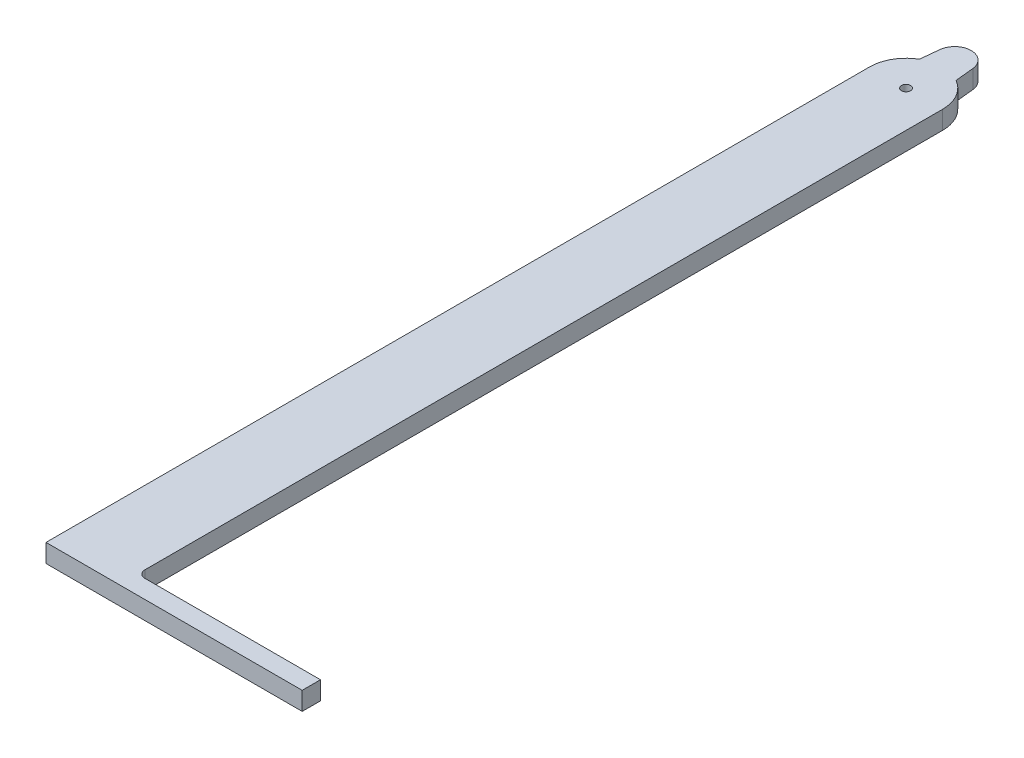
ISO-10303-21;
HEADER;
FILE_DESCRIPTION(('STEP AP214'),'2;1');
FILE_NAME('part.step','',(''),(''),'','','');
FILE_SCHEMA(('AUTOMOTIVE_DESIGN { 1 0 10303 214 1 1 1 1 }'));
ENDSEC;
DATA;
#1=APPLICATION_CONTEXT('core data for automotive mechanical design processes');
#2=APPLICATION_PROTOCOL_DEFINITION('international standard','automotive_design',2000,#1);
#3=PRODUCT_CONTEXT('',#1,'mechanical');
#4=PRODUCT('Part','Part','',(#3));
#5=PRODUCT_RELATED_PRODUCT_CATEGORY('part','',(#4));
#6=PRODUCT_DEFINITION_FORMATION('','',#4);
#7=PRODUCT_DEFINITION_CONTEXT('part definition',#1,'design');
#8=PRODUCT_DEFINITION('design','',#6,#7);
#9=PRODUCT_DEFINITION_SHAPE('','',#8);
#10=(LENGTH_UNIT() NAMED_UNIT(*) SI_UNIT(.MILLI.,.METRE.));
#11=(NAMED_UNIT(*) PLANE_ANGLE_UNIT() SI_UNIT($,.RADIAN.));
#12=(NAMED_UNIT(*) SI_UNIT($,.STERADIAN.) SOLID_ANGLE_UNIT());
#13=UNCERTAINTY_MEASURE_WITH_UNIT(LENGTH_MEASURE(1.E-05),#10,'distance_accuracy_value','');
#14=(GEOMETRIC_REPRESENTATION_CONTEXT(3) GLOBAL_UNCERTAINTY_ASSIGNED_CONTEXT((#13)) GLOBAL_UNIT_ASSIGNED_CONTEXT((#10,
#11,#12)) REPRESENTATION_CONTEXT('',''));
#15=CARTESIAN_POINT('',(0.,0.,0.));
#16=DIRECTION('',(0.,0.,1.));
#17=DIRECTION('',(1.,0.,0.));
#18=AXIS2_PLACEMENT_3D('',#15,#16,#17);
#19=CARTESIAN_POINT('',(0.,6.35,0.));
#20=DIRECTION('',(0.,-1.,0.));
#21=DIRECTION('',(0.,0.,-1.));
#22=AXIS2_PLACEMENT_3D('',#19,#20,#21);
#23=CYLINDRICAL_SURFACE('',#22,12.7);
#24=CARTESIAN_POINT('',(0.,6.35,0.));
#25=DIRECTION('',(0.,1.,0.));
#26=DIRECTION('',(0.,0.,1.));
#27=AXIS2_PLACEMENT_3D('',#24,#25,#26);
#28=CIRCLE('',#27,12.7);
#29=CARTESIAN_POINT('',(-6.37039518248316,6.35,-10.9867222236204));
#30=VERTEX_POINT('',#29);
#31=CARTESIAN_POINT('',(-12.7,6.35,0.));
#32=VERTEX_POINT('',#31);
#33=EDGE_CURVE('E193',#30,#32,#28,.T.);
#34=ORIENTED_EDGE('',*,*,#33,.F.);
#35=DIRECTION('',(0.,-1.,0.));
#36=VECTOR('',#35,1.);
#37=CARTESIAN_POINT('',(-6.37039518248315,6.35,-10.9867222236204));
#38=LINE('',#37,#36);
#39=CARTESIAN_POINT('',(-6.37039518248316,0.,-10.9867222236204));
#40=VERTEX_POINT('',#39);
#41=EDGE_CURVE('E150',#30,#40,#38,.T.);
#42=ORIENTED_EDGE('',*,*,#41,.T.);
#43=CARTESIAN_POINT('',(0.,0.,0.));
#44=DIRECTION('',(0.,1.,0.));
#45=DIRECTION('',(0.,0.,1.));
#46=AXIS2_PLACEMENT_3D('',#43,#44,#45);
#47=CIRCLE('',#46,12.7);
#48=CARTESIAN_POINT('',(-12.7,0.,0.));
#49=VERTEX_POINT('',#48);
#50=EDGE_CURVE('E189',#40,#49,#47,.T.);
#51=ORIENTED_EDGE('',*,*,#50,.T.);
#52=DIRECTION('',(0.,-1.,0.));
#53=VECTOR('',#52,1.);
#54=CARTESIAN_POINT('',(-12.7,6.35,0.));
#55=LINE('',#54,#53);
#56=EDGE_CURVE('E178',#32,#49,#55,.T.);
#57=ORIENTED_EDGE('',*,*,#56,.F.);
#58=EDGE_LOOP('',(#34,#42,#51,#57));
#59=FACE_BOUND('',#58,.T.);
#60=ADVANCED_FACE('F35',(#59),#23,.T.);
#61=CARTESIAN_POINT('',(12.7,6.35,0.));
#62=DIRECTION('',(1.,0.,0.));
#63=DIRECTION('',(0.,0.,-1.));
#64=AXIS2_PLACEMENT_3D('',#61,#62,#63);
#65=PLANE('',#64);
#66=DIRECTION('',(0.,0.,1.));
#67=VECTOR('',#66,1.);
#68=CARTESIAN_POINT('',(12.7,6.35,0.));
#69=LINE('',#68,#67);
#70=CARTESIAN_POINT('',(12.7,6.35,0.));
#71=VERTEX_POINT('',#70);
#72=CARTESIAN_POINT('',(12.7,6.35,276.86));
#73=VERTEX_POINT('',#72);
#74=EDGE_CURVE('E192',#71,#73,#69,.T.);
#75=ORIENTED_EDGE('',*,*,#74,.T.);
#76=DIRECTION('',(0.,-1.,0.));
#77=VECTOR('',#76,1.);
#78=CARTESIAN_POINT('',(12.7,0.,276.86));
#79=LINE('',#78,#77);
#80=CARTESIAN_POINT('',(12.7,0.,276.86));
#81=VERTEX_POINT('',#80);
#82=EDGE_CURVE('E165',#73,#81,#79,.T.);
#83=ORIENTED_EDGE('',*,*,#82,.T.);
#84=DIRECTION('',(0.,0.,1.));
#85=VECTOR('',#84,1.);
#86=CARTESIAN_POINT('',(12.7,0.,0.));
#87=LINE('',#86,#85);
#88=CARTESIAN_POINT('',(12.7,0.,0.));
#89=VERTEX_POINT('',#88);
#90=EDGE_CURVE('E187',#89,#81,#87,.T.);
#91=ORIENTED_EDGE('',*,*,#90,.F.);
#92=DIRECTION('',(0.,-1.,0.));
#93=VECTOR('',#92,1.);
#94=CARTESIAN_POINT('',(12.7,6.35,0.));
#95=LINE('',#94,#93);
#96=EDGE_CURVE('E173',#71,#89,#95,.T.);
#97=ORIENTED_EDGE('',*,*,#96,.F.);
#98=EDGE_LOOP('',(#75,#83,#91,#97));
#99=FACE_BOUND('',#98,.T.);
#100=ADVANCED_FACE('F244',(#99),#65,.T.);
#101=CARTESIAN_POINT('',(6.37039518248316,0.,-10.9867222236204));
#102=VERTEX_POINT('',#101);
#103=EDGE_CURVE('E199',#89,#102,#47,.T.);
#104=ORIENTED_EDGE('',*,*,#103,.T.);
#105=DIRECTION('',(0.,-1.,0.));
#106=VECTOR('',#105,1.);
#107=CARTESIAN_POINT('',(6.37039518248316,6.35,-10.9867222236204));
#108=LINE('',#107,#106);
#109=CARTESIAN_POINT('',(6.37039518248316,6.35,-10.9867222236204));
#110=VERTEX_POINT('',#109);
#111=EDGE_CURVE('E128',#102,#110,#108,.F.);
#112=ORIENTED_EDGE('',*,*,#111,.T.);
#113=EDGE_CURVE('E197',#71,#110,#28,.T.);
#114=ORIENTED_EDGE('',*,*,#113,.F.);
#115=ORIENTED_EDGE('',*,*,#96,.T.);
#116=EDGE_LOOP('',(#104,#112,#114,#115));
#117=FACE_BOUND('',#116,.T.);
#118=ADVANCED_FACE('F243',(#117),#23,.T.);
#119=CARTESIAN_POINT('',(-12.7,6.35,0.));
#120=DIRECTION('',(1.,0.,0.));
#121=DIRECTION('',(0.,0.,-1.));
#122=AXIS2_PLACEMENT_3D('',#119,#120,#121);
#123=PLANE('',#122);
#124=DIRECTION('',(0.,0.,1.));
#125=VECTOR('',#124,1.);
#126=CARTESIAN_POINT('',(-12.7,0.,0.));
#127=LINE('',#126,#125);
#128=CARTESIAN_POINT('',(-12.7,0.,285.75));
#129=VERTEX_POINT('',#128);
#130=EDGE_CURVE('E194',#49,#129,#127,.T.);
#131=ORIENTED_EDGE('',*,*,#130,.T.);
#132=DIRECTION('',(0.,1.,0.));
#133=VECTOR('',#132,1.);
#134=CARTESIAN_POINT('',(-12.7,-89.1264971823756,285.75));
#135=LINE('',#134,#133);
#136=CARTESIAN_POINT('',(-12.7,6.35,285.75));
#137=VERTEX_POINT('',#136);
#138=EDGE_CURVE('E211',#129,#137,#135,.T.);
#139=ORIENTED_EDGE('',*,*,#138,.T.);
#140=DIRECTION('',(0.,0.,1.));
#141=VECTOR('',#140,1.);
#142=CARTESIAN_POINT('',(-12.7,6.35,0.));
#143=LINE('',#142,#141);
#144=EDGE_CURVE('E183',#32,#137,#143,.T.);
#145=ORIENTED_EDGE('',*,*,#144,.F.);
#146=ORIENTED_EDGE('',*,*,#56,.T.);
#147=EDGE_LOOP('',(#131,#139,#145,#146));
#148=FACE_BOUND('',#147,.T.);
#149=ADVANCED_FACE('F221',(#148),#123,.F.);
#150=CARTESIAN_POINT('',(0.,6.35,0.));
#151=DIRECTION('',(0.,1.,0.));
#152=DIRECTION('',(0.,0.,1.));
#153=AXIS2_PLACEMENT_3D('',#150,#151,#152);
#154=PLANE('',#153);
#155=CARTESIAN_POINT('',(0.,6.35,0.));
#156=DIRECTION('',(0.,-1.,0.));
#157=DIRECTION('',(0.,0.,-1.));
#158=AXIS2_PLACEMENT_3D('',#155,#156,#157);
#159=CIRCLE('',#158,1.5875);
#160=CARTESIAN_POINT('',(0.,6.35,-1.5875));
#161=VERTEX_POINT('',#160);
#162=EDGE_CURVE('E132',#161,#161,#159,.T.);
#163=ORIENTED_EDGE('',*,*,#162,.T.);
#164=EDGE_LOOP('',(#163));
#165=FACE_BOUND('',#164,.T.);
#166=ORIENTED_EDGE('',*,*,#113,.T.);
#167=DIRECTION('',(0.10317527247145,0.,0.994663190809051));
#168=VECTOR('',#167,1.);
#169=CARTESIAN_POINT('',(7.38412422898595,6.35,-1.21384793061289));
#170=LINE('',#169,#168);
#171=CARTESIAN_POINT('',(5.69805563081873,6.35,-17.4684245515761));
#172=VERTEX_POINT('',#171);
#173=EDGE_CURVE('E50',#172,#110,#170,.T.);
#174=ORIENTED_EDGE('',*,*,#173,.F.);
#175=CARTESIAN_POINT('',(0.,6.35,-16.8773717734101));
#176=DIRECTION('',(0.,1.,0.));
#177=DIRECTION('',(0.,0.,1.));
#178=AXIS2_PLACEMENT_3D('',#175,#176,#177);
#179=CIRCLE('',#178,5.72862822658993);
#180=CARTESIAN_POINT('',(-5.69805563081873,6.35,-17.4684245515761));
#181=VERTEX_POINT('',#180);
#182=EDGE_CURVE('E123',#181,#172,#179,.F.);
#183=ORIENTED_EDGE('',*,*,#182,.F.);
#184=DIRECTION('',(0.10317527247145,0.,-0.994663190809051));
#185=VECTOR('',#184,1.);
#186=CARTESIAN_POINT('',(-5.69805563081873,6.35,-17.4684245515761));
#187=LINE('',#186,#185);
#188=EDGE_CURVE('E137',#30,#181,#187,.T.);
#189=ORIENTED_EDGE('',*,*,#188,.F.);
#190=ORIENTED_EDGE('',*,*,#33,.T.);
#191=ORIENTED_EDGE('',*,*,#144,.T.);
#192=DIRECTION('',(1.,0.,0.));
#193=VECTOR('',#192,1.);
#194=CARTESIAN_POINT('',(-12.7,6.35,285.75));
#195=LINE('',#194,#193);
#196=CARTESIAN_POINT('',(76.2,6.35,285.75));
#197=VERTEX_POINT('',#196);
#198=EDGE_CURVE('E153',#137,#197,#195,.T.);
#199=ORIENTED_EDGE('',*,*,#198,.T.);
#200=DIRECTION('',(0.,0.,-1.));
#201=VECTOR('',#200,1.);
#202=CARTESIAN_POINT('',(76.2,6.35,279.4));
#203=LINE('',#202,#201);
#204=CARTESIAN_POINT('',(76.2,6.35,279.4));
#205=VERTEX_POINT('',#204);
#206=EDGE_CURVE('E212',#197,#205,#203,.T.);
#207=ORIENTED_EDGE('',*,*,#206,.T.);
#208=DIRECTION('',(-1.,0.,0.));
#209=VECTOR('',#208,1.);
#210=CARTESIAN_POINT('',(-12.7,6.35,279.4));
#211=LINE('',#210,#209);
#212=CARTESIAN_POINT('',(15.24,6.35,279.4));
#213=VERTEX_POINT('',#212);
#214=EDGE_CURVE('E208',#205,#213,#211,.T.);
#215=ORIENTED_EDGE('',*,*,#214,.T.);
#216=CARTESIAN_POINT('',(15.24,6.35,276.86));
#217=DIRECTION('',(0.,1.,0.));
#218=DIRECTION('',(0.,0.,1.));
#219=AXIS2_PLACEMENT_3D('',#216,#217,#218);
#220=CIRCLE('',#219,2.54);
#221=EDGE_CURVE('E11',#213,#73,#220,.F.);
#222=ORIENTED_EDGE('',*,*,#221,.T.);
#223=ORIENTED_EDGE('',*,*,#74,.F.);
#224=EDGE_LOOP('',(#166,#174,#183,#189,#190,#191,#199,#207,#215,#222,#223));
#225=FACE_BOUND('',#224,.T.);
#226=ADVANCED_FACE('F230',(#165,#225),#154,.T.);
#227=CARTESIAN_POINT('',(0.,0.,0.));
#228=DIRECTION('',(0.,1.,0.));
#229=DIRECTION('',(0.,0.,1.));
#230=AXIS2_PLACEMENT_3D('',#227,#228,#229);
#231=PLANE('',#230);
#232=CARTESIAN_POINT('',(0.,0.,0.));
#233=DIRECTION('',(0.,-1.,0.));
#234=DIRECTION('',(0.,0.,-1.));
#235=AXIS2_PLACEMENT_3D('',#232,#233,#234);
#236=CIRCLE('',#235,1.5875);
#237=CARTESIAN_POINT('',(0.,0.,-1.5875));
#238=VERTEX_POINT('',#237);
#239=EDGE_CURVE('E143',#238,#238,#236,.T.);
#240=ORIENTED_EDGE('',*,*,#239,.F.);
#241=EDGE_LOOP('',(#240));
#242=FACE_BOUND('',#241,.T.);
#243=ORIENTED_EDGE('',*,*,#50,.F.);
#244=DIRECTION('',(0.10317527247145,0.,-0.994663190809051));
#245=VECTOR('',#244,1.);
#246=CARTESIAN_POINT('',(-5.69805563081873,0.,-17.4684245515761));
#247=LINE('',#246,#245);
#248=CARTESIAN_POINT('',(-5.69805563081873,0.,-17.4684245515761));
#249=VERTEX_POINT('',#248);
#250=EDGE_CURVE('E131',#40,#249,#247,.T.);
#251=ORIENTED_EDGE('',*,*,#250,.T.);
#252=CARTESIAN_POINT('',(0.,0.,-16.8773717734101));
#253=DIRECTION('',(0.,-1.,0.));
#254=DIRECTION('',(0.,0.,-1.));
#255=AXIS2_PLACEMENT_3D('',#252,#253,#254);
#256=CIRCLE('',#255,5.72862822658993);
#257=CARTESIAN_POINT('',(5.69805563081873,0.,-17.4684245515761));
#258=VERTEX_POINT('',#257);
#259=EDGE_CURVE('E121',#249,#258,#256,.T.);
#260=ORIENTED_EDGE('',*,*,#259,.T.);
#261=DIRECTION('',(0.10317527247145,0.,0.994663190809051));
#262=VECTOR('',#261,1.);
#263=CARTESIAN_POINT('',(7.38412422898595,0.,-1.21384793061289));
#264=LINE('',#263,#262);
#265=EDGE_CURVE('E126',#258,#102,#264,.T.);
#266=ORIENTED_EDGE('',*,*,#265,.T.);
#267=ORIENTED_EDGE('',*,*,#103,.F.);
#268=ORIENTED_EDGE('',*,*,#90,.T.);
#269=CARTESIAN_POINT('',(15.24,0.,276.86));
#270=DIRECTION('',(0.,1.,0.));
#271=DIRECTION('',(0.,0.,1.));
#272=AXIS2_PLACEMENT_3D('',#269,#270,#271);
#273=CIRCLE('',#272,2.54);
#274=CARTESIAN_POINT('',(15.24,0.,279.4));
#275=VERTEX_POINT('',#274);
#276=EDGE_CURVE('E43',#81,#275,#273,.T.);
#277=ORIENTED_EDGE('',*,*,#276,.T.);
#278=DIRECTION('',(1.,0.,0.));
#279=VECTOR('',#278,1.);
#280=CARTESIAN_POINT('',(-12.7,0.,279.4));
#281=LINE('',#280,#279);
#282=CARTESIAN_POINT('',(76.2,0.,279.4));
#283=VERTEX_POINT('',#282);
#284=EDGE_CURVE('E156',#275,#283,#281,.T.);
#285=ORIENTED_EDGE('',*,*,#284,.T.);
#286=DIRECTION('',(0.,0.,1.));
#287=VECTOR('',#286,1.);
#288=CARTESIAN_POINT('',(76.2,0.,279.4));
#289=LINE('',#288,#287);
#290=CARTESIAN_POINT('',(76.2,0.,285.75));
#291=VERTEX_POINT('',#290);
#292=EDGE_CURVE('E154',#283,#291,#289,.T.);
#293=ORIENTED_EDGE('',*,*,#292,.T.);
#294=DIRECTION('',(-1.,0.,0.));
#295=VECTOR('',#294,1.);
#296=CARTESIAN_POINT('',(-12.7,0.,285.75));
#297=LINE('',#296,#295);
#298=EDGE_CURVE('E164',#291,#129,#297,.T.);
#299=ORIENTED_EDGE('',*,*,#298,.T.);
#300=ORIENTED_EDGE('',*,*,#130,.F.);
#301=EDGE_LOOP('',(#243,#251,#260,#266,#267,#268,#277,#285,#293,#299,#300));
#302=FACE_BOUND('',#301,.T.);
#303=ADVANCED_FACE('F135',(#242,#302),#231,.F.);
#304=CARTESIAN_POINT('',(-12.7,-89.1264971823756,279.4));
#305=DIRECTION('',(0.,0.,-1.));
#306=DIRECTION('',(-1.,0.,0.));
#307=AXIS2_PLACEMENT_3D('',#304,#305,#306);
#308=PLANE('',#307);
#309=ORIENTED_EDGE('',*,*,#284,.F.);
#310=DIRECTION('',(0.,-1.,0.));
#311=VECTOR('',#310,1.);
#312=CARTESIAN_POINT('',(15.24,6.35,279.4));
#313=LINE('',#312,#311);
#314=EDGE_CURVE('E167',#275,#213,#313,.F.);
#315=ORIENTED_EDGE('',*,*,#314,.T.);
#316=ORIENTED_EDGE('',*,*,#214,.F.);
#317=DIRECTION('',(0.,1.,0.));
#318=VECTOR('',#317,1.);
#319=CARTESIAN_POINT('',(76.2,-89.1264971823756,279.4));
#320=LINE('',#319,#318);
#321=EDGE_CURVE('E157',#283,#205,#320,.T.);
#322=ORIENTED_EDGE('',*,*,#321,.F.);
#323=EDGE_LOOP('',(#309,#315,#316,#322));
#324=FACE_BOUND('',#323,.T.);
#325=ADVANCED_FACE('F234',(#324),#308,.T.);
#326=CARTESIAN_POINT('',(76.2,-89.1264971823756,279.4));
#327=DIRECTION('',(1.,0.,0.));
#328=DIRECTION('',(0.,0.,-1.));
#329=AXIS2_PLACEMENT_3D('',#326,#327,#328);
#330=PLANE('',#329);
#331=ORIENTED_EDGE('',*,*,#292,.F.);
#332=ORIENTED_EDGE('',*,*,#321,.T.);
#333=ORIENTED_EDGE('',*,*,#206,.F.);
#334=DIRECTION('',(0.,1.,0.));
#335=VECTOR('',#334,1.);
#336=CARTESIAN_POINT('',(76.2,-89.1264971823756,285.75));
#337=LINE('',#336,#335);
#338=EDGE_CURVE('E217',#291,#197,#337,.T.);
#339=ORIENTED_EDGE('',*,*,#338,.F.);
#340=EDGE_LOOP('',(#331,#332,#333,#339));
#341=FACE_BOUND('',#340,.T.);
#342=ADVANCED_FACE('F236',(#341),#330,.T.);
#343=CARTESIAN_POINT('',(-12.7,-89.1264971823756,285.75));
#344=DIRECTION('',(0.,0.,1.));
#345=DIRECTION('',(1.,0.,0.));
#346=AXIS2_PLACEMENT_3D('',#343,#344,#345);
#347=PLANE('',#346);
#348=ORIENTED_EDGE('',*,*,#298,.F.);
#349=ORIENTED_EDGE('',*,*,#338,.T.);
#350=ORIENTED_EDGE('',*,*,#198,.F.);
#351=ORIENTED_EDGE('',*,*,#138,.F.);
#352=EDGE_LOOP('',(#348,#349,#350,#351));
#353=FACE_BOUND('',#352,.T.);
#354=ADVANCED_FACE('F225',(#353),#347,.T.);
#355=CARTESIAN_POINT('',(15.24,6.35,276.86));
#356=DIRECTION('',(0.,1.,0.));
#357=DIRECTION('',(0.,0.,1.));
#358=AXIS2_PLACEMENT_3D('',#355,#356,#357);
#359=CYLINDRICAL_SURFACE('',#358,2.54);
#360=ORIENTED_EDGE('',*,*,#221,.F.);
#361=ORIENTED_EDGE('',*,*,#314,.F.);
#362=ORIENTED_EDGE('',*,*,#276,.F.);
#363=ORIENTED_EDGE('',*,*,#82,.F.);
#364=EDGE_LOOP('',(#360,#361,#362,#363));
#365=FACE_BOUND('',#364,.T.);
#366=ADVANCED_FACE('F37',(#365),#359,.F.);
#367=CARTESIAN_POINT('',(-5.69805563081873,32.3447173994289,-17.4684245515761));
#368=DIRECTION('',(-0.994663190809051,0.,-0.10317527247145));
#369=DIRECTION('',(-0.10317527247145,0.,0.994663190809051));
#370=AXIS2_PLACEMENT_3D('',#367,#368,#369);
#371=PLANE('',#370);
#372=ORIENTED_EDGE('',*,*,#41,.F.);
#373=ORIENTED_EDGE('',*,*,#188,.T.);
#374=DIRECTION('',(0.,-1.,0.));
#375=VECTOR('',#374,1.);
#376=CARTESIAN_POINT('',(-5.69805563081873,32.3447173994289,-17.4684245515761));
#377=LINE('',#376,#375);
#378=EDGE_CURVE('E139',#181,#249,#377,.T.);
#379=ORIENTED_EDGE('',*,*,#378,.T.);
#380=ORIENTED_EDGE('',*,*,#250,.F.);
#381=EDGE_LOOP('',(#372,#373,#379,#380));
#382=FACE_BOUND('',#381,.T.);
#383=ADVANCED_FACE('F242',(#382),#371,.T.);
#384=CARTESIAN_POINT('',(7.38412422898595,32.3447173994289,-1.21384793061289));
#385=DIRECTION('',(0.994663190809051,0.,-0.10317527247145));
#386=DIRECTION('',(-0.10317527247145,0.,-0.994663190809051));
#387=AXIS2_PLACEMENT_3D('',#384,#385,#386);
#388=PLANE('',#387);
#389=ORIENTED_EDGE('',*,*,#111,.F.);
#390=ORIENTED_EDGE('',*,*,#265,.F.);
#391=DIRECTION('',(0.,-1.,0.));
#392=VECTOR('',#391,1.);
#393=CARTESIAN_POINT('',(5.69805563081873,32.3447173994289,-17.4684245515761));
#394=LINE('',#393,#392);
#395=EDGE_CURVE('E116',#172,#258,#394,.T.);
#396=ORIENTED_EDGE('',*,*,#395,.F.);
#397=ORIENTED_EDGE('',*,*,#173,.T.);
#398=EDGE_LOOP('',(#389,#390,#396,#397));
#399=FACE_BOUND('',#398,.T.);
#400=ADVANCED_FACE('F127',(#399),#388,.T.);
#401=CARTESIAN_POINT('',(0.,32.3447173994289,-16.8773717734101));
#402=DIRECTION('',(0.,-1.,0.));
#403=DIRECTION('',(0.,0.,-1.));
#404=AXIS2_PLACEMENT_3D('',#401,#402,#403);
#405=CYLINDRICAL_SURFACE('',#404,5.72862822658993);
#406=ORIENTED_EDGE('',*,*,#378,.F.);
#407=ORIENTED_EDGE('',*,*,#182,.T.);
#408=ORIENTED_EDGE('',*,*,#395,.T.);
#409=ORIENTED_EDGE('',*,*,#259,.F.);
#410=EDGE_LOOP('',(#406,#407,#408,#409));
#411=FACE_BOUND('',#410,.T.);
#412=ADVANCED_FACE('F119',(#411),#405,.T.);
#413=CARTESIAN_POINT('',(0.,6.35,0.));
#414=DIRECTION('',(0.,-1.,0.));
#415=DIRECTION('',(0.,0.,-1.));
#416=AXIS2_PLACEMENT_3D('',#413,#414,#415);
#417=CYLINDRICAL_SURFACE('',#416,1.5875);
#418=ORIENTED_EDGE('',*,*,#162,.F.);
#419=EDGE_LOOP('',(#418));
#420=FACE_BOUND('',#419,.T.);
#421=ORIENTED_EDGE('',*,*,#239,.T.);
#422=EDGE_LOOP('',(#421));
#423=FACE_BOUND('',#422,.T.);
#424=ADVANCED_FACE('F270',(#420,#423),#417,.F.);
#425=CLOSED_SHELL('',(#60,#100,#118,#149,#226,#303,#325,#342,#354,#366,#383,#400,#412,#424));
#426=MANIFOLD_SOLID_BREP('B2',#425);
#427=ADVANCED_BREP_SHAPE_REPRESENTATION('',(#18,#426),#14);
#428=SHAPE_DEFINITION_REPRESENTATION(#9,#427);
ENDSEC;
END-ISO-10303-21;
